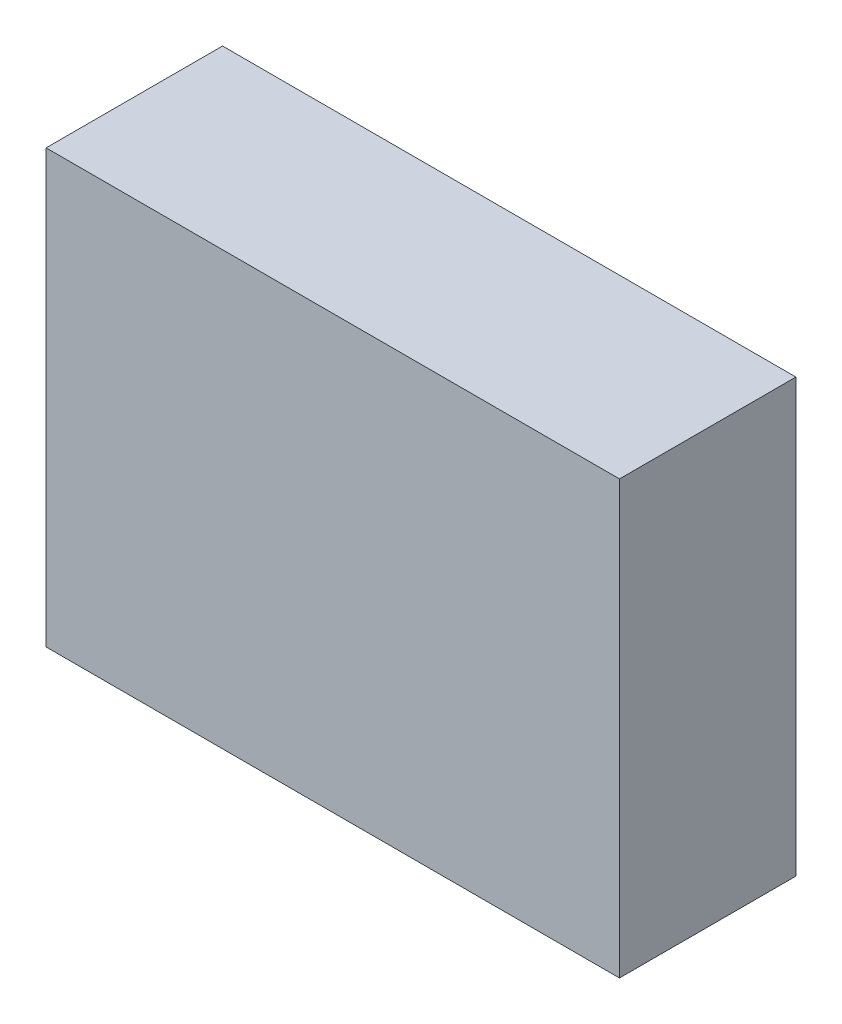
ISO-10303-21;
HEADER;
FILE_DESCRIPTION(('STEP AP214'),'2;1');
FILE_NAME('part.step','',(''),(''),'','','');
FILE_SCHEMA(('AUTOMOTIVE_DESIGN { 1 0 10303 214 1 1 1 1 }'));
ENDSEC;
DATA;
#1=APPLICATION_CONTEXT('core data for automotive mechanical design processes');
#2=APPLICATION_PROTOCOL_DEFINITION('international standard','automotive_design',2000,#1);
#3=PRODUCT_CONTEXT('',#1,'mechanical');
#4=PRODUCT('Part','Part','',(#3));
#5=PRODUCT_RELATED_PRODUCT_CATEGORY('part','',(#4));
#6=PRODUCT_DEFINITION_FORMATION('','',#4);
#7=PRODUCT_DEFINITION_CONTEXT('part definition',#1,'design');
#8=PRODUCT_DEFINITION('design','',#6,#7);
#9=PRODUCT_DEFINITION_SHAPE('','',#8);
#10=(LENGTH_UNIT() NAMED_UNIT(*) SI_UNIT(.MILLI.,.METRE.));
#11=(NAMED_UNIT(*) PLANE_ANGLE_UNIT() SI_UNIT($,.RADIAN.));
#12=(NAMED_UNIT(*) SI_UNIT($,.STERADIAN.) SOLID_ANGLE_UNIT());
#13=UNCERTAINTY_MEASURE_WITH_UNIT(LENGTH_MEASURE(1.E-05),#10,'distance_accuracy_value','');
#14=(GEOMETRIC_REPRESENTATION_CONTEXT(3) GLOBAL_UNCERTAINTY_ASSIGNED_CONTEXT((#13)) GLOBAL_UNIT_ASSIGNED_CONTEXT((#10,
#11,#12)) REPRESENTATION_CONTEXT('',''));
#15=CARTESIAN_POINT('',(0.,0.,0.));
#16=DIRECTION('',(0.,0.,1.));
#17=DIRECTION('',(1.,0.,0.));
#18=AXIS2_PLACEMENT_3D('',#15,#16,#17);
#19=CARTESIAN_POINT('',(-25.,-20.,20.));
#20=DIRECTION('',(1.,0.,0.));
#21=DIRECTION('',(0.,0.,-1.));
#22=AXIS2_PLACEMENT_3D('',#19,#20,#21);
#23=PLANE('',#22);
#24=DIRECTION('',(0.,-1.,0.));
#25=VECTOR('',#24,1.);
#26=CARTESIAN_POINT('',(-25.,-20.,0.));
#27=LINE('',#26,#25);
#28=CARTESIAN_POINT('',(-25.,29.,0.));
#29=VERTEX_POINT('',#28);
#30=CARTESIAN_POINT('',(-25.,-20.,0.));
#31=VERTEX_POINT('',#30);
#32=EDGE_CURVE('E104',#29,#31,#27,.T.);
#33=ORIENTED_EDGE('',*,*,#32,.T.);
#34=DIRECTION('',(0.,0.,-1.));
#35=VECTOR('',#34,1.);
#36=CARTESIAN_POINT('',(-25.,-20.,20.));
#37=LINE('',#36,#35);
#38=CARTESIAN_POINT('',(-25.,-20.,20.));
#39=VERTEX_POINT('',#38);
#40=EDGE_CURVE('E11',#39,#31,#37,.T.);
#41=ORIENTED_EDGE('',*,*,#40,.F.);
#42=DIRECTION('',(0.,-1.,0.));
#43=VECTOR('',#42,1.);
#44=CARTESIAN_POINT('',(-25.,-20.,20.));
#45=LINE('',#44,#43);
#46=CARTESIAN_POINT('',(-25.,29.,20.));
#47=VERTEX_POINT('',#46);
#48=EDGE_CURVE('E92',#47,#39,#45,.T.);
#49=ORIENTED_EDGE('',*,*,#48,.F.);
#50=DIRECTION('',(0.,0.,-1.));
#51=VECTOR('',#50,1.);
#52=CARTESIAN_POINT('',(-25.,29.,20.));
#53=LINE('',#52,#51);
#54=EDGE_CURVE('E100',#47,#29,#53,.T.);
#55=ORIENTED_EDGE('',*,*,#54,.T.);
#56=EDGE_LOOP('',(#33,#41,#49,#55));
#57=FACE_BOUND('',#56,.T.);
#58=ADVANCED_FACE('F41',(#57),#23,.F.);
#59=CARTESIAN_POINT('',(-25.,-20.,20.));
#60=DIRECTION('',(0.,1.,0.));
#61=DIRECTION('',(0.,0.,1.));
#62=AXIS2_PLACEMENT_3D('',#59,#60,#61);
#63=PLANE('',#62);
#64=DIRECTION('',(1.,0.,0.));
#65=VECTOR('',#64,1.);
#66=CARTESIAN_POINT('',(-25.,-20.,0.));
#67=LINE('',#66,#65);
#68=CARTESIAN_POINT('',(40.,-20.,0.));
#69=VERTEX_POINT('',#68);
#70=EDGE_CURVE('E96',#31,#69,#67,.T.);
#71=ORIENTED_EDGE('',*,*,#70,.T.);
#72=DIRECTION('',(0.,0.,-1.));
#73=VECTOR('',#72,1.);
#74=CARTESIAN_POINT('',(40.,-20.,20.));
#75=LINE('',#74,#73);
#76=CARTESIAN_POINT('',(40.,-20.,20.));
#77=VERTEX_POINT('',#76);
#78=EDGE_CURVE('E49',#77,#69,#75,.T.);
#79=ORIENTED_EDGE('',*,*,#78,.F.);
#80=DIRECTION('',(1.,0.,0.));
#81=VECTOR('',#80,1.);
#82=CARTESIAN_POINT('',(-25.,-20.,20.));
#83=LINE('',#82,#81);
#84=EDGE_CURVE('E87',#39,#77,#83,.T.);
#85=ORIENTED_EDGE('',*,*,#84,.F.);
#86=ORIENTED_EDGE('',*,*,#40,.T.);
#87=EDGE_LOOP('',(#71,#79,#85,#86));
#88=FACE_BOUND('',#87,.T.);
#89=ADVANCED_FACE('F95',(#88),#63,.F.);
#90=CARTESIAN_POINT('',(40.,-20.,20.));
#91=DIRECTION('',(-1.,0.,0.));
#92=DIRECTION('',(0.,0.,1.));
#93=AXIS2_PLACEMENT_3D('',#90,#91,#92);
#94=PLANE('',#93);
#95=DIRECTION('',(0.,1.,0.));
#96=VECTOR('',#95,1.);
#97=CARTESIAN_POINT('',(40.,-20.,0.));
#98=LINE('',#97,#96);
#99=CARTESIAN_POINT('',(40.,29.,0.));
#100=VERTEX_POINT('',#99);
#101=EDGE_CURVE('E74',#69,#100,#98,.T.);
#102=ORIENTED_EDGE('',*,*,#101,.T.);
#103=DIRECTION('',(0.,0.,-1.));
#104=VECTOR('',#103,1.);
#105=CARTESIAN_POINT('',(40.,29.,20.));
#106=LINE('',#105,#104);
#107=CARTESIAN_POINT('',(40.,29.,20.));
#108=VERTEX_POINT('',#107);
#109=EDGE_CURVE('E97',#108,#100,#106,.T.);
#110=ORIENTED_EDGE('',*,*,#109,.F.);
#111=DIRECTION('',(0.,1.,0.));
#112=VECTOR('',#111,1.);
#113=CARTESIAN_POINT('',(40.,-20.,20.));
#114=LINE('',#113,#112);
#115=EDGE_CURVE('E90',#77,#108,#114,.T.);
#116=ORIENTED_EDGE('',*,*,#115,.F.);
#117=ORIENTED_EDGE('',*,*,#78,.T.);
#118=EDGE_LOOP('',(#102,#110,#116,#117));
#119=FACE_BOUND('',#118,.T.);
#120=ADVANCED_FACE('F98',(#119),#94,.F.);
#121=CARTESIAN_POINT('',(-25.,29.,20.));
#122=DIRECTION('',(0.,-1.,0.));
#123=DIRECTION('',(0.,0.,-1.));
#124=AXIS2_PLACEMENT_3D('',#121,#122,#123);
#125=PLANE('',#124);
#126=DIRECTION('',(-1.,0.,0.));
#127=VECTOR('',#126,1.);
#128=CARTESIAN_POINT('',(-25.,29.,0.));
#129=LINE('',#128,#127);
#130=EDGE_CURVE('E80',#100,#29,#129,.T.);
#131=ORIENTED_EDGE('',*,*,#130,.T.);
#132=ORIENTED_EDGE('',*,*,#54,.F.);
#133=DIRECTION('',(-1.,0.,0.));
#134=VECTOR('',#133,1.);
#135=CARTESIAN_POINT('',(-25.,29.,20.));
#136=LINE('',#135,#134);
#137=EDGE_CURVE('E57',#108,#47,#136,.T.);
#138=ORIENTED_EDGE('',*,*,#137,.F.);
#139=ORIENTED_EDGE('',*,*,#109,.T.);
#140=EDGE_LOOP('',(#131,#132,#138,#139));
#141=FACE_BOUND('',#140,.T.);
#142=ADVANCED_FACE('F111',(#141),#125,.F.);
#143=CARTESIAN_POINT('',(0.,0.,20.));
#144=DIRECTION('',(0.,0.,-1.));
#145=DIRECTION('',(-1.,0.,0.));
#146=AXIS2_PLACEMENT_3D('',#143,#144,#145);
#147=PLANE('',#146);
#148=ORIENTED_EDGE('',*,*,#48,.T.);
#149=ORIENTED_EDGE('',*,*,#84,.T.);
#150=ORIENTED_EDGE('',*,*,#115,.T.);
#151=ORIENTED_EDGE('',*,*,#137,.T.);
#152=EDGE_LOOP('',(#148,#149,#150,#151));
#153=FACE_BOUND('',#152,.T.);
#154=ADVANCED_FACE('F88',(#153),#147,.F.);
#155=CARTESIAN_POINT('',(0.,0.,0.));
#156=DIRECTION('',(0.,0.,-1.));
#157=DIRECTION('',(-1.,0.,0.));
#158=AXIS2_PLACEMENT_3D('',#155,#156,#157);
#159=PLANE('',#158);
#160=ORIENTED_EDGE('',*,*,#32,.F.);
#161=ORIENTED_EDGE('',*,*,#130,.F.);
#162=ORIENTED_EDGE('',*,*,#101,.F.);
#163=ORIENTED_EDGE('',*,*,#70,.F.);
#164=EDGE_LOOP('',(#160,#161,#162,#163));
#165=FACE_BOUND('',#164,.T.);
#166=ADVANCED_FACE('F114',(#165),#159,.T.);
#167=CLOSED_SHELL('',(#58,#89,#120,#142,#154,#166));
#168=MANIFOLD_SOLID_BREP('B2',#167);
#169=ADVANCED_BREP_SHAPE_REPRESENTATION('',(#18,#168),#14);
#170=SHAPE_DEFINITION_REPRESENTATION(#9,#169);
ENDSEC;
END-ISO-10303-21;
